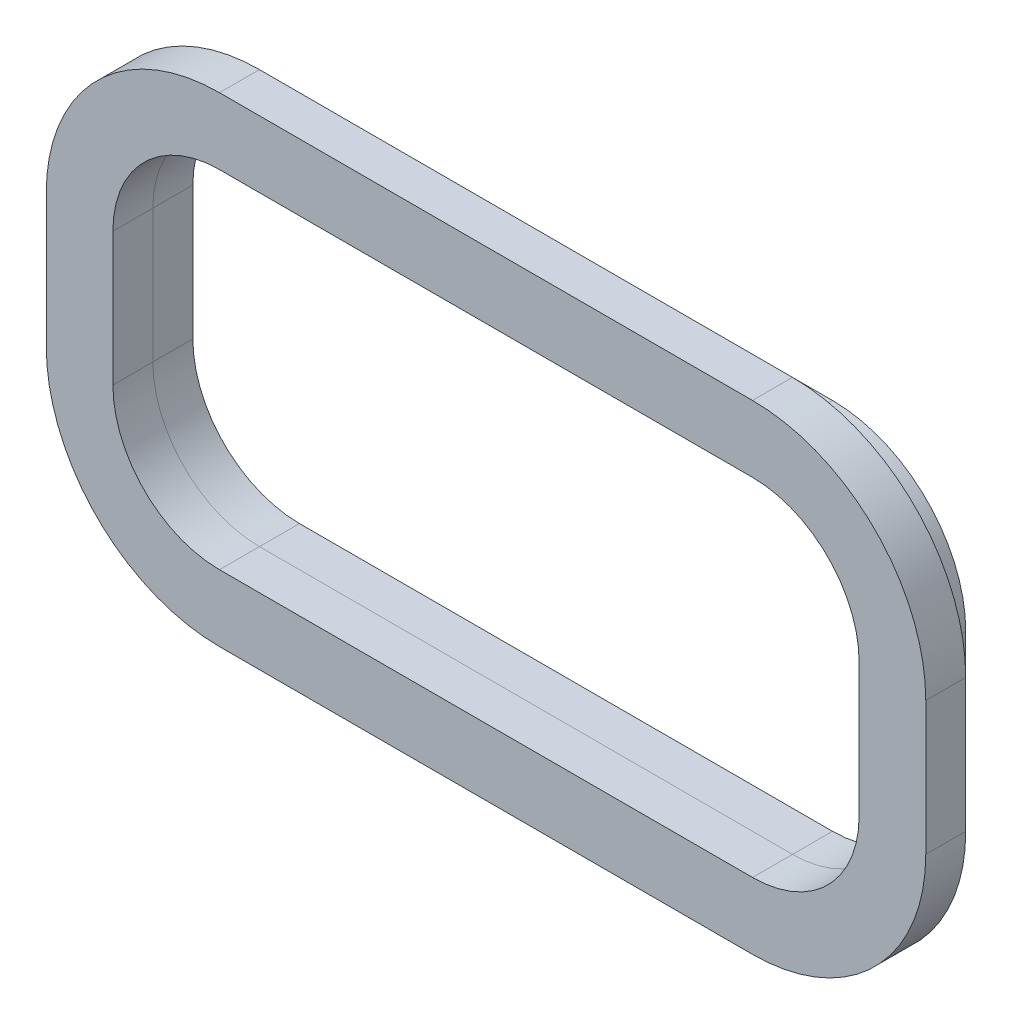
ISO-10303-21;
HEADER;
FILE_DESCRIPTION(('STEP AP214'),'2;1');
FILE_NAME('part.step','',(''),(''),'','','');
FILE_SCHEMA(('AUTOMOTIVE_DESIGN { 1 0 10303 214 1 1 1 1 }'));
ENDSEC;
DATA;
#1=APPLICATION_CONTEXT('core data for automotive mechanical design processes');
#2=APPLICATION_PROTOCOL_DEFINITION('international standard','automotive_design',2000,#1);
#3=PRODUCT_CONTEXT('',#1,'mechanical');
#4=PRODUCT('Part','Part','',(#3));
#5=PRODUCT_RELATED_PRODUCT_CATEGORY('part','',(#4));
#6=PRODUCT_DEFINITION_FORMATION('','',#4);
#7=PRODUCT_DEFINITION_CONTEXT('part definition',#1,'design');
#8=PRODUCT_DEFINITION('design','',#6,#7);
#9=PRODUCT_DEFINITION_SHAPE('','',#8);
#10=(LENGTH_UNIT() NAMED_UNIT(*) SI_UNIT(.MILLI.,.METRE.));
#11=(NAMED_UNIT(*) PLANE_ANGLE_UNIT() SI_UNIT($,.RADIAN.));
#12=(NAMED_UNIT(*) SI_UNIT($,.STERADIAN.) SOLID_ANGLE_UNIT());
#13=UNCERTAINTY_MEASURE_WITH_UNIT(LENGTH_MEASURE(1.E-05),#10,'distance_accuracy_value','');
#14=(GEOMETRIC_REPRESENTATION_CONTEXT(3) GLOBAL_UNCERTAINTY_ASSIGNED_CONTEXT((#13)) GLOBAL_UNIT_ASSIGNED_CONTEXT((#10,
#11,#12)) REPRESENTATION_CONTEXT('',''));
#15=CARTESIAN_POINT('',(0.,0.,0.));
#16=DIRECTION('',(0.,0.,1.));
#17=DIRECTION('',(1.,0.,0.));
#18=AXIS2_PLACEMENT_3D('',#15,#16,#17);
#19=CARTESIAN_POINT('',(0.,-17.6264705882353,6.));
#20=DIRECTION('',(0.,1.,0.));
#21=DIRECTION('',(0.,0.,1.));
#22=AXIS2_PLACEMENT_3D('',#19,#20,#21);
#23=PLANE('',#22);
#24=DIRECTION('',(1.,0.,0.));
#25=VECTOR('',#24,1.);
#26=CARTESIAN_POINT('',(0.,-17.6264705882353,3.));
#27=LINE('',#26,#25);
#28=CARTESIAN_POINT('',(-21.3216547429783,-17.6264705882353,3.));
#29=VERTEX_POINT('',#28);
#30=CARTESIAN_POINT('',(18.6783452570217,-17.6264705882353,3.));
#31=VERTEX_POINT('',#30);
#32=EDGE_CURVE('E212',#29,#31,#27,.T.);
#33=ORIENTED_EDGE('',*,*,#32,.T.);
#34=DIRECTION('',(0.,0.,-1.));
#35=VECTOR('',#34,1.);
#36=CARTESIAN_POINT('',(18.6783452570217,-17.6264705882353,6.));
#37=LINE('',#36,#35);
#38=CARTESIAN_POINT('',(18.6783452570217,-17.6264705882353,6.));
#39=VERTEX_POINT('',#38);
#40=EDGE_CURVE('E12',#39,#31,#37,.T.);
#41=ORIENTED_EDGE('',*,*,#40,.F.);
#42=DIRECTION('',(1.,0.,0.));
#43=VECTOR('',#42,1.);
#44=CARTESIAN_POINT('',(0.,-17.6264705882353,6.));
#45=LINE('',#44,#43);
#46=CARTESIAN_POINT('',(-21.3216547429783,-17.6264705882353,6.));
#47=VERTEX_POINT('',#46);
#48=EDGE_CURVE('E224',#47,#39,#45,.T.);
#49=ORIENTED_EDGE('',*,*,#48,.F.);
#50=DIRECTION('',(0.,0.,-1.));
#51=VECTOR('',#50,1.);
#52=CARTESIAN_POINT('',(-21.3216547429783,-17.6264705882353,6.));
#53=LINE('',#52,#51);
#54=EDGE_CURVE('E242',#47,#29,#53,.T.);
#55=ORIENTED_EDGE('',*,*,#54,.T.);
#56=EDGE_LOOP('',(#33,#41,#49,#55));
#57=FACE_BOUND('',#56,.T.);
#58=ADVANCED_FACE('F43',(#57),#23,.F.);
#59=CARTESIAN_POINT('',(18.6783452570217,-4.6264705882353,6.));
#60=DIRECTION('',(0.,0.,-1.));
#61=DIRECTION('',(-1.,0.,0.));
#62=AXIS2_PLACEMENT_3D('',#59,#60,#61);
#63=CYLINDRICAL_SURFACE('',#62,13.);
#64=CARTESIAN_POINT('',(18.6783452570217,-4.6264705882353,3.));
#65=DIRECTION('',(0.,0.,1.));
#66=DIRECTION('',(1.,0.,0.));
#67=AXIS2_PLACEMENT_3D('',#64,#65,#66);
#68=CIRCLE('',#67,13.);
#69=CARTESIAN_POINT('',(31.6783452570217,-4.6264705882353,3.));
#70=VERTEX_POINT('',#69);
#71=EDGE_CURVE('E245',#31,#70,#68,.T.);
#72=ORIENTED_EDGE('',*,*,#71,.T.);
#73=DIRECTION('',(0.,0.,-1.));
#74=VECTOR('',#73,1.);
#75=CARTESIAN_POINT('',(31.6783452570217,-4.6264705882353,6.));
#76=LINE('',#75,#74);
#77=CARTESIAN_POINT('',(31.6783452570217,-4.6264705882353,6.));
#78=VERTEX_POINT('',#77);
#79=EDGE_CURVE('E50',#78,#70,#76,.T.);
#80=ORIENTED_EDGE('',*,*,#79,.F.);
#81=CARTESIAN_POINT('',(18.6783452570217,-4.6264705882353,6.));
#82=DIRECTION('',(0.,0.,1.));
#83=DIRECTION('',(1.,0.,0.));
#84=AXIS2_PLACEMENT_3D('',#81,#82,#83);
#85=CIRCLE('',#84,13.);
#86=EDGE_CURVE('E227',#39,#78,#85,.T.);
#87=ORIENTED_EDGE('',*,*,#86,.F.);
#88=ORIENTED_EDGE('',*,*,#40,.T.);
#89=EDGE_LOOP('',(#72,#80,#87,#88));
#90=FACE_BOUND('',#89,.T.);
#91=ADVANCED_FACE('F300',(#90),#63,.T.);
#92=CARTESIAN_POINT('',(31.6783452570217,0.,6.));
#93=DIRECTION('',(-1.,0.,0.));
#94=DIRECTION('',(0.,-1.,0.));
#95=AXIS2_PLACEMENT_3D('',#92,#93,#94);
#96=PLANE('',#95);
#97=DIRECTION('',(0.,1.,0.));
#98=VECTOR('',#97,1.);
#99=CARTESIAN_POINT('',(31.6783452570217,0.,3.));
#100=LINE('',#99,#98);
#101=CARTESIAN_POINT('',(31.6783452570217,5.3735294117647,3.));
#102=VERTEX_POINT('',#101);
#103=EDGE_CURVE('E247',#70,#102,#100,.T.);
#104=ORIENTED_EDGE('',*,*,#103,.T.);
#105=DIRECTION('',(0.,0.,-1.));
#106=VECTOR('',#105,1.);
#107=CARTESIAN_POINT('',(31.6783452570217,5.3735294117647,6.));
#108=LINE('',#107,#106);
#109=CARTESIAN_POINT('',(31.6783452570217,5.3735294117647,6.));
#110=VERTEX_POINT('',#109);
#111=EDGE_CURVE('E272',#110,#102,#108,.T.);
#112=ORIENTED_EDGE('',*,*,#111,.F.);
#113=DIRECTION('',(0.,1.,0.));
#114=VECTOR('',#113,1.);
#115=CARTESIAN_POINT('',(31.6783452570217,0.,6.));
#116=LINE('',#115,#114);
#117=EDGE_CURVE('E230',#78,#110,#116,.T.);
#118=ORIENTED_EDGE('',*,*,#117,.F.);
#119=ORIENTED_EDGE('',*,*,#79,.T.);
#120=EDGE_LOOP('',(#104,#112,#118,#119));
#121=FACE_BOUND('',#120,.T.);
#122=ADVANCED_FACE('F279',(#121),#96,.F.);
#123=CARTESIAN_POINT('',(18.6783452570217,5.3735294117647,6.));
#124=DIRECTION('',(0.,0.,-1.));
#125=DIRECTION('',(-1.,0.,0.));
#126=AXIS2_PLACEMENT_3D('',#123,#124,#125);
#127=CYLINDRICAL_SURFACE('',#126,13.);
#128=CARTESIAN_POINT('',(18.6783452570217,5.3735294117647,3.));
#129=DIRECTION('',(0.,0.,1.));
#130=DIRECTION('',(1.,0.,0.));
#131=AXIS2_PLACEMENT_3D('',#128,#129,#130);
#132=CIRCLE('',#131,13.);
#133=CARTESIAN_POINT('',(18.6783452570217,18.3735294117647,3.));
#134=VERTEX_POINT('',#133);
#135=EDGE_CURVE('E249',#102,#134,#132,.T.);
#136=ORIENTED_EDGE('',*,*,#135,.T.);
#137=DIRECTION('',(0.,0.,-1.));
#138=VECTOR('',#137,1.);
#139=CARTESIAN_POINT('',(18.6783452570217,18.3735294117647,6.));
#140=LINE('',#139,#138);
#141=CARTESIAN_POINT('',(18.6783452570217,18.3735294117647,6.));
#142=VERTEX_POINT('',#141);
#143=EDGE_CURVE('E269',#142,#134,#140,.T.);
#144=ORIENTED_EDGE('',*,*,#143,.F.);
#145=CARTESIAN_POINT('',(18.6783452570217,5.3735294117647,6.));
#146=DIRECTION('',(0.,0.,1.));
#147=DIRECTION('',(1.,0.,0.));
#148=AXIS2_PLACEMENT_3D('',#145,#146,#147);
#149=CIRCLE('',#148,13.);
#150=EDGE_CURVE('E232',#110,#142,#149,.T.);
#151=ORIENTED_EDGE('',*,*,#150,.F.);
#152=ORIENTED_EDGE('',*,*,#111,.T.);
#153=EDGE_LOOP('',(#136,#144,#151,#152));
#154=FACE_BOUND('',#153,.T.);
#155=ADVANCED_FACE('F290',(#154),#127,.T.);
#156=CARTESIAN_POINT('',(0.,18.3735294117647,6.));
#157=DIRECTION('',(0.,-1.,0.));
#158=DIRECTION('',(1.,0.,0.));
#159=AXIS2_PLACEMENT_3D('',#156,#157,#158);
#160=PLANE('',#159);
#161=DIRECTION('',(-1.,0.,0.));
#162=VECTOR('',#161,1.);
#163=CARTESIAN_POINT('',(0.,18.3735294117647,3.));
#164=LINE('',#163,#162);
#165=CARTESIAN_POINT('',(-21.3216547429783,18.3735294117647,3.));
#166=VERTEX_POINT('',#165);
#167=EDGE_CURVE('E251',#134,#166,#164,.T.);
#168=ORIENTED_EDGE('',*,*,#167,.T.);
#169=DIRECTION('',(0.,0.,-1.));
#170=VECTOR('',#169,1.);
#171=CARTESIAN_POINT('',(-21.3216547429783,18.3735294117647,6.));
#172=LINE('',#171,#170);
#173=CARTESIAN_POINT('',(-21.3216547429783,18.3735294117647,6.));
#174=VERTEX_POINT('',#173);
#175=EDGE_CURVE('E266',#174,#166,#172,.T.);
#176=ORIENTED_EDGE('',*,*,#175,.F.);
#177=DIRECTION('',(-1.,0.,0.));
#178=VECTOR('',#177,1.);
#179=CARTESIAN_POINT('',(0.,18.3735294117647,6.));
#180=LINE('',#179,#178);
#181=EDGE_CURVE('E234',#142,#174,#180,.T.);
#182=ORIENTED_EDGE('',*,*,#181,.F.);
#183=ORIENTED_EDGE('',*,*,#143,.T.);
#184=EDGE_LOOP('',(#168,#176,#182,#183));
#185=FACE_BOUND('',#184,.T.);
#186=ADVANCED_FACE('F294',(#185),#160,.F.);
#187=CARTESIAN_POINT('',(-21.3216547429783,5.3735294117647,6.));
#188=DIRECTION('',(0.,0.,-1.));
#189=DIRECTION('',(-1.,0.,0.));
#190=AXIS2_PLACEMENT_3D('',#187,#188,#189);
#191=CYLINDRICAL_SURFACE('',#190,13.);
#192=CARTESIAN_POINT('',(-21.3216547429783,5.3735294117647,3.));
#193=DIRECTION('',(0.,0.,1.));
#194=DIRECTION('',(1.,0.,0.));
#195=AXIS2_PLACEMENT_3D('',#192,#193,#194);
#196=CIRCLE('',#195,13.);
#197=CARTESIAN_POINT('',(-34.3216547429783,5.3735294117647,3.));
#198=VERTEX_POINT('',#197);
#199=EDGE_CURVE('E253',#166,#198,#196,.T.);
#200=ORIENTED_EDGE('',*,*,#199,.T.);
#201=DIRECTION('',(0.,0.,-1.));
#202=VECTOR('',#201,1.);
#203=CARTESIAN_POINT('',(-34.3216547429783,5.3735294117647,6.));
#204=LINE('',#203,#202);
#205=CARTESIAN_POINT('',(-34.3216547429783,5.3735294117647,6.));
#206=VERTEX_POINT('',#205);
#207=EDGE_CURVE('E263',#206,#198,#204,.T.);
#208=ORIENTED_EDGE('',*,*,#207,.F.);
#209=CARTESIAN_POINT('',(-21.3216547429783,5.3735294117647,6.));
#210=DIRECTION('',(0.,0.,1.));
#211=DIRECTION('',(1.,0.,0.));
#212=AXIS2_PLACEMENT_3D('',#209,#210,#211);
#213=CIRCLE('',#212,13.);
#214=EDGE_CURVE('E236',#174,#206,#213,.T.);
#215=ORIENTED_EDGE('',*,*,#214,.F.);
#216=ORIENTED_EDGE('',*,*,#175,.T.);
#217=EDGE_LOOP('',(#200,#208,#215,#216));
#218=FACE_BOUND('',#217,.T.);
#219=ADVANCED_FACE('F313',(#218),#191,.T.);
#220=CARTESIAN_POINT('',(-34.3216547429783,0.,6.));
#221=DIRECTION('',(1.,0.,0.));
#222=DIRECTION('',(0.,1.,0.));
#223=AXIS2_PLACEMENT_3D('',#220,#221,#222);
#224=PLANE('',#223);
#225=DIRECTION('',(0.,-1.,0.));
#226=VECTOR('',#225,1.);
#227=CARTESIAN_POINT('',(-34.3216547429783,0.,3.));
#228=LINE('',#227,#226);
#229=CARTESIAN_POINT('',(-34.3216547429783,-4.6264705882353,3.));
#230=VERTEX_POINT('',#229);
#231=EDGE_CURVE('E255',#198,#230,#228,.T.);
#232=ORIENTED_EDGE('',*,*,#231,.T.);
#233=DIRECTION('',(0.,0.,-1.));
#234=VECTOR('',#233,1.);
#235=CARTESIAN_POINT('',(-34.3216547429783,-4.6264705882353,6.));
#236=LINE('',#235,#234);
#237=CARTESIAN_POINT('',(-34.3216547429783,-4.6264705882353,6.));
#238=VERTEX_POINT('',#237);
#239=EDGE_CURVE('E260',#238,#230,#236,.T.);
#240=ORIENTED_EDGE('',*,*,#239,.F.);
#241=DIRECTION('',(0.,-1.,0.));
#242=VECTOR('',#241,1.);
#243=CARTESIAN_POINT('',(-34.3216547429783,0.,6.));
#244=LINE('',#243,#242);
#245=EDGE_CURVE('E238',#206,#238,#244,.T.);
#246=ORIENTED_EDGE('',*,*,#245,.F.);
#247=ORIENTED_EDGE('',*,*,#207,.T.);
#248=EDGE_LOOP('',(#232,#240,#246,#247));
#249=FACE_BOUND('',#248,.T.);
#250=ADVANCED_FACE('F311',(#249),#224,.F.);
#251=CARTESIAN_POINT('',(-21.3216547429783,-4.6264705882353,6.));
#252=DIRECTION('',(0.,0.,-1.));
#253=DIRECTION('',(-1.,0.,0.));
#254=AXIS2_PLACEMENT_3D('',#251,#252,#253);
#255=CYLINDRICAL_SURFACE('',#254,13.);
#256=CARTESIAN_POINT('',(-21.3216547429783,-4.6264705882353,3.));
#257=DIRECTION('',(0.,0.,1.));
#258=DIRECTION('',(1.,0.,0.));
#259=AXIS2_PLACEMENT_3D('',#256,#257,#258);
#260=CIRCLE('',#259,13.);
#261=EDGE_CURVE('E228',#230,#29,#260,.T.);
#262=ORIENTED_EDGE('',*,*,#261,.T.);
#263=ORIENTED_EDGE('',*,*,#54,.F.);
#264=CARTESIAN_POINT('',(-21.3216547429783,-4.6264705882353,6.));
#265=DIRECTION('',(0.,0.,1.));
#266=DIRECTION('',(1.,0.,0.));
#267=AXIS2_PLACEMENT_3D('',#264,#265,#266);
#268=CIRCLE('',#267,13.);
#269=EDGE_CURVE('E240',#238,#47,#268,.T.);
#270=ORIENTED_EDGE('',*,*,#269,.F.);
#271=ORIENTED_EDGE('',*,*,#239,.T.);
#272=EDGE_LOOP('',(#262,#263,#270,#271));
#273=FACE_BOUND('',#272,.T.);
#274=ADVANCED_FACE('F306',(#273),#255,.T.);
#275=CARTESIAN_POINT('',(0.,0.,6.));
#276=DIRECTION('',(0.,0.,1.));
#277=DIRECTION('',(1.,0.,0.));
#278=AXIS2_PLACEMENT_3D('',#275,#276,#277);
#279=PLANE('',#278);
#280=CARTESIAN_POINT('',(-21.3216547429783,5.3735294117647,6.));
#281=DIRECTION('',(0.,0.,-1.));
#282=DIRECTION('',(-1.,0.,0.));
#283=AXIS2_PLACEMENT_3D('',#280,#281,#282);
#284=CIRCLE('',#283,8.);
#285=CARTESIAN_POINT('',(-29.3216547429783,5.3735294117647,6.));
#286=VERTEX_POINT('',#285);
#287=CARTESIAN_POINT('',(-21.3216547429783,13.3735294117647,6.));
#288=VERTEX_POINT('',#287);
#289=EDGE_CURVE('E157',#286,#288,#284,.T.);
#290=ORIENTED_EDGE('',*,*,#289,.T.);
#291=DIRECTION('',(1.,0.,0.));
#292=VECTOR('',#291,1.);
#293=CARTESIAN_POINT('',(-21.3216547429783,13.3735294117647,6.));
#294=LINE('',#293,#292);
#295=CARTESIAN_POINT('',(18.6783452570217,13.3735294117647,6.));
#296=VERTEX_POINT('',#295);
#297=EDGE_CURVE('E166',#288,#296,#294,.T.);
#298=ORIENTED_EDGE('',*,*,#297,.T.);
#299=CARTESIAN_POINT('',(18.6783452570217,5.3735294117647,6.));
#300=DIRECTION('',(0.,0.,-1.));
#301=DIRECTION('',(-1.,0.,0.));
#302=AXIS2_PLACEMENT_3D('',#299,#300,#301);
#303=CIRCLE('',#302,8.);
#304=CARTESIAN_POINT('',(26.6783452570217,5.3735294117647,6.));
#305=VERTEX_POINT('',#304);
#306=EDGE_CURVE('E57',#296,#305,#303,.T.);
#307=ORIENTED_EDGE('',*,*,#306,.T.);
#308=DIRECTION('',(0.,-1.,0.));
#309=VECTOR('',#308,1.);
#310=CARTESIAN_POINT('',(26.6783452570217,5.37352941176469,6.));
#311=LINE('',#310,#309);
#312=CARTESIAN_POINT('',(26.6783452570217,-4.62647058823531,6.));
#313=VERTEX_POINT('',#312);
#314=EDGE_CURVE('E181',#305,#313,#311,.T.);
#315=ORIENTED_EDGE('',*,*,#314,.T.);
#316=CARTESIAN_POINT('',(18.6783452570217,-4.6264705882353,6.));
#317=DIRECTION('',(0.,0.,-1.));
#318=DIRECTION('',(-1.,0.,0.));
#319=AXIS2_PLACEMENT_3D('',#316,#317,#318);
#320=CIRCLE('',#319,7.99999999999999);
#321=CARTESIAN_POINT('',(18.6783452570217,-12.6264705882353,6.));
#322=VERTEX_POINT('',#321);
#323=EDGE_CURVE('E184',#313,#322,#320,.T.);
#324=ORIENTED_EDGE('',*,*,#323,.T.);
#325=DIRECTION('',(-1.,0.,0.));
#326=VECTOR('',#325,1.);
#327=CARTESIAN_POINT('',(18.6783452570217,-12.6264705882353,6.));
#328=LINE('',#327,#326);
#329=CARTESIAN_POINT('',(-21.3216547429783,-12.6264705882353,6.));
#330=VERTEX_POINT('',#329);
#331=EDGE_CURVE('E187',#322,#330,#328,.T.);
#332=ORIENTED_EDGE('',*,*,#331,.T.);
#333=CARTESIAN_POINT('',(-21.3216547429783,-4.6264705882353,6.));
#334=DIRECTION('',(0.,0.,-1.));
#335=DIRECTION('',(-1.,0.,0.));
#336=AXIS2_PLACEMENT_3D('',#333,#334,#335);
#337=CIRCLE('',#336,8.);
#338=CARTESIAN_POINT('',(-29.3216547429783,-4.6264705882353,6.));
#339=VERTEX_POINT('',#338);
#340=EDGE_CURVE('E190',#330,#339,#337,.T.);
#341=ORIENTED_EDGE('',*,*,#340,.T.);
#342=DIRECTION('',(0.,1.,0.));
#343=VECTOR('',#342,1.);
#344=CARTESIAN_POINT('',(-29.3216547429783,-4.6264705882353,6.));
#345=LINE('',#344,#343);
#346=EDGE_CURVE('E163',#339,#286,#345,.T.);
#347=ORIENTED_EDGE('',*,*,#346,.T.);
#348=EDGE_LOOP('',(#290,#298,#307,#315,#324,#332,#341,#347));
#349=FACE_BOUND('',#348,.T.);
#350=ORIENTED_EDGE('',*,*,#48,.T.);
#351=ORIENTED_EDGE('',*,*,#86,.T.);
#352=ORIENTED_EDGE('',*,*,#117,.T.);
#353=ORIENTED_EDGE('',*,*,#150,.T.);
#354=ORIENTED_EDGE('',*,*,#181,.T.);
#355=ORIENTED_EDGE('',*,*,#214,.T.);
#356=ORIENTED_EDGE('',*,*,#245,.T.);
#357=ORIENTED_EDGE('',*,*,#269,.T.);
#358=EDGE_LOOP('',(#350,#351,#352,#353,#354,#355,#356,#357));
#359=FACE_BOUND('',#358,.T.);
#360=ADVANCED_FACE('F170',(#349,#359),#279,.T.);
#361=CARTESIAN_POINT('',(0.,0.,3.));
#362=DIRECTION('',(0.,0.,1.));
#363=DIRECTION('',(1.,0.,0.));
#364=AXIS2_PLACEMENT_3D('',#361,#362,#363);
#365=PLANE('',#364);
#366=DIRECTION('',(1.,0.,0.));
#367=VECTOR('',#366,1.);
#368=CARTESIAN_POINT('',(-21.3216547429783,13.3735294117647,3.));
#369=LINE('',#368,#367);
#370=CARTESIAN_POINT('',(-21.3216547429783,13.3735294117647,3.));
#371=VERTEX_POINT('',#370);
#372=CARTESIAN_POINT('',(18.6783452570217,13.3735294117647,3.));
#373=VERTEX_POINT('',#372);
#374=EDGE_CURVE('E194',#371,#373,#369,.T.);
#375=ORIENTED_EDGE('',*,*,#374,.F.);
#376=CARTESIAN_POINT('',(-21.3216547429783,5.3735294117647,3.));
#377=DIRECTION('',(0.,0.,-1.));
#378=DIRECTION('',(-1.,0.,0.));
#379=AXIS2_PLACEMENT_3D('',#376,#377,#378);
#380=CIRCLE('',#379,8.);
#381=CARTESIAN_POINT('',(-29.3216547429783,5.3735294117647,3.));
#382=VERTEX_POINT('',#381);
#383=EDGE_CURVE('E65',#382,#371,#380,.T.);
#384=ORIENTED_EDGE('',*,*,#383,.F.);
#385=DIRECTION('',(0.,1.,0.));
#386=VECTOR('',#385,1.);
#387=CARTESIAN_POINT('',(-29.3216547429783,-4.6264705882353,3.));
#388=LINE('',#387,#386);
#389=CARTESIAN_POINT('',(-29.3216547429783,-4.6264705882353,3.));
#390=VERTEX_POINT('',#389);
#391=EDGE_CURVE('E174',#390,#382,#388,.T.);
#392=ORIENTED_EDGE('',*,*,#391,.F.);
#393=CARTESIAN_POINT('',(-21.3216547429783,-4.6264705882353,3.));
#394=DIRECTION('',(0.,0.,-1.));
#395=DIRECTION('',(-1.,0.,0.));
#396=AXIS2_PLACEMENT_3D('',#393,#394,#395);
#397=CIRCLE('',#396,8.);
#398=CARTESIAN_POINT('',(-21.3216547429783,-12.6264705882353,3.));
#399=VERTEX_POINT('',#398);
#400=EDGE_CURVE('E177',#399,#390,#397,.T.);
#401=ORIENTED_EDGE('',*,*,#400,.F.);
#402=DIRECTION('',(-1.,0.,0.));
#403=VECTOR('',#402,1.);
#404=CARTESIAN_POINT('',(18.6783452570217,-12.6264705882353,3.));
#405=LINE('',#404,#403);
#406=CARTESIAN_POINT('',(18.6783452570217,-12.6264705882353,3.));
#407=VERTEX_POINT('',#406);
#408=EDGE_CURVE('E205',#407,#399,#405,.T.);
#409=ORIENTED_EDGE('',*,*,#408,.F.);
#410=CARTESIAN_POINT('',(18.6783452570217,-4.6264705882353,3.));
#411=DIRECTION('',(0.,0.,-1.));
#412=DIRECTION('',(-1.,0.,0.));
#413=AXIS2_PLACEMENT_3D('',#410,#411,#412);
#414=CIRCLE('',#413,7.99999999999999);
#415=CARTESIAN_POINT('',(26.6783452570217,-4.62647058823531,3.));
#416=VERTEX_POINT('',#415);
#417=EDGE_CURVE('E202',#416,#407,#414,.T.);
#418=ORIENTED_EDGE('',*,*,#417,.F.);
#419=DIRECTION('',(0.,-1.,0.));
#420=VECTOR('',#419,1.);
#421=CARTESIAN_POINT('',(26.6783452570217,5.37352941176469,3.));
#422=LINE('',#421,#420);
#423=CARTESIAN_POINT('',(26.6783452570217,5.3735294117647,3.));
#424=VERTEX_POINT('',#423);
#425=EDGE_CURVE('E199',#424,#416,#422,.T.);
#426=ORIENTED_EDGE('',*,*,#425,.F.);
#427=CARTESIAN_POINT('',(18.6783452570217,5.3735294117647,3.));
#428=DIRECTION('',(0.,0.,-1.));
#429=DIRECTION('',(-1.,0.,0.));
#430=AXIS2_PLACEMENT_3D('',#427,#428,#429);
#431=CIRCLE('',#430,8.);
#432=EDGE_CURVE('E196',#373,#424,#431,.T.);
#433=ORIENTED_EDGE('',*,*,#432,.F.);
#434=EDGE_LOOP('',(#375,#384,#392,#401,#409,#418,#426,#433));
#435=FACE_BOUND('',#434,.T.);
#436=ORIENTED_EDGE('',*,*,#32,.F.);
#437=ORIENTED_EDGE('',*,*,#261,.F.);
#438=ORIENTED_EDGE('',*,*,#231,.F.);
#439=ORIENTED_EDGE('',*,*,#199,.F.);
#440=ORIENTED_EDGE('',*,*,#167,.F.);
#441=ORIENTED_EDGE('',*,*,#135,.F.);
#442=ORIENTED_EDGE('',*,*,#103,.F.);
#443=ORIENTED_EDGE('',*,*,#71,.F.);
#444=EDGE_LOOP('',(#436,#437,#438,#439,#440,#441,#442,#443));
#445=FACE_BOUND('',#444,.T.);
#446=ADVANCED_FACE('F285',(#435,#445),#365,.F.);
#447=CARTESIAN_POINT('',(-21.3216547429783,5.3735294117647,6.));
#448=DIRECTION('',(0.,0.,-1.));
#449=DIRECTION('',(-1.,0.,0.));
#450=AXIS2_PLACEMENT_3D('',#447,#448,#449);
#451=CYLINDRICAL_SURFACE('',#450,8.);
#452=ORIENTED_EDGE('',*,*,#383,.T.);
#453=DIRECTION('',(0.,0.,-1.));
#454=VECTOR('',#453,1.);
#455=CARTESIAN_POINT('',(-21.3216547429783,13.3735294117647,6.));
#456=LINE('',#455,#454);
#457=EDGE_CURVE('E153',#288,#371,#456,.T.);
#458=ORIENTED_EDGE('',*,*,#457,.F.);
#459=ORIENTED_EDGE('',*,*,#289,.F.);
#460=DIRECTION('',(0.,0.,-1.));
#461=VECTOR('',#460,1.);
#462=CARTESIAN_POINT('',(-29.3216547429783,5.3735294117647,6.));
#463=LINE('',#462,#461);
#464=EDGE_CURVE('E210',#286,#382,#463,.T.);
#465=ORIENTED_EDGE('',*,*,#464,.T.);
#466=EDGE_LOOP('',(#452,#458,#459,#465));
#467=FACE_BOUND('',#466,.T.);
#468=ADVANCED_FACE('F155',(#467),#451,.F.);
#469=CARTESIAN_POINT('',(-29.3216547429783,-4.6264705882353,6.));
#470=DIRECTION('',(-1.,0.,0.));
#471=DIRECTION('',(0.,0.,1.));
#472=AXIS2_PLACEMENT_3D('',#469,#470,#471);
#473=PLANE('',#472);
#474=ORIENTED_EDGE('',*,*,#391,.T.);
#475=ORIENTED_EDGE('',*,*,#464,.F.);
#476=ORIENTED_EDGE('',*,*,#346,.F.);
#477=DIRECTION('',(0.,0.,-1.));
#478=VECTOR('',#477,1.);
#479=CARTESIAN_POINT('',(-29.3216547429783,-4.6264705882353,6.));
#480=LINE('',#479,#478);
#481=EDGE_CURVE('E213',#339,#390,#480,.T.);
#482=ORIENTED_EDGE('',*,*,#481,.T.);
#483=EDGE_LOOP('',(#474,#475,#476,#482));
#484=FACE_BOUND('',#483,.T.);
#485=ADVANCED_FACE('F384',(#484),#473,.F.);
#486=CARTESIAN_POINT('',(-21.3216547429783,-4.6264705882353,6.));
#487=DIRECTION('',(0.,0.,-1.));
#488=DIRECTION('',(-1.,0.,0.));
#489=AXIS2_PLACEMENT_3D('',#486,#487,#488);
#490=CYLINDRICAL_SURFACE('',#489,8.);
#491=ORIENTED_EDGE('',*,*,#400,.T.);
#492=ORIENTED_EDGE('',*,*,#481,.F.);
#493=ORIENTED_EDGE('',*,*,#340,.F.);
#494=DIRECTION('',(0.,0.,-1.));
#495=VECTOR('',#494,1.);
#496=CARTESIAN_POINT('',(-21.3216547429783,-12.6264705882353,6.));
#497=LINE('',#496,#495);
#498=EDGE_CURVE('E215',#330,#399,#497,.T.);
#499=ORIENTED_EDGE('',*,*,#498,.T.);
#500=EDGE_LOOP('',(#491,#492,#493,#499));
#501=FACE_BOUND('',#500,.T.);
#502=ADVANCED_FACE('F393',(#501),#490,.F.);
#503=CARTESIAN_POINT('',(18.6783452570217,-12.6264705882353,6.));
#504=DIRECTION('',(0.,-1.,0.));
#505=DIRECTION('',(1.,0.,0.));
#506=AXIS2_PLACEMENT_3D('',#503,#504,#505);
#507=PLANE('',#506);
#508=ORIENTED_EDGE('',*,*,#408,.T.);
#509=ORIENTED_EDGE('',*,*,#498,.F.);
#510=ORIENTED_EDGE('',*,*,#331,.F.);
#511=DIRECTION('',(0.,0.,-1.));
#512=VECTOR('',#511,1.);
#513=CARTESIAN_POINT('',(18.6783452570217,-12.6264705882353,6.));
#514=LINE('',#513,#512);
#515=EDGE_CURVE('E217',#322,#407,#514,.T.);
#516=ORIENTED_EDGE('',*,*,#515,.T.);
#517=EDGE_LOOP('',(#508,#509,#510,#516));
#518=FACE_BOUND('',#517,.T.);
#519=ADVANCED_FACE('F403',(#518),#507,.F.);
#520=CARTESIAN_POINT('',(18.6783452570217,-4.6264705882353,6.));
#521=DIRECTION('',(0.,0.,-1.));
#522=DIRECTION('',(-1.,0.,0.));
#523=AXIS2_PLACEMENT_3D('',#520,#521,#522);
#524=CYLINDRICAL_SURFACE('',#523,7.99999999999999);
#525=ORIENTED_EDGE('',*,*,#417,.T.);
#526=ORIENTED_EDGE('',*,*,#515,.F.);
#527=ORIENTED_EDGE('',*,*,#323,.F.);
#528=DIRECTION('',(0.,0.,-1.));
#529=VECTOR('',#528,1.);
#530=CARTESIAN_POINT('',(26.6783452570217,-4.62647058823531,6.));
#531=LINE('',#530,#529);
#532=EDGE_CURVE('E219',#313,#416,#531,.T.);
#533=ORIENTED_EDGE('',*,*,#532,.T.);
#534=EDGE_LOOP('',(#525,#526,#527,#533));
#535=FACE_BOUND('',#534,.T.);
#536=ADVANCED_FACE('F413',(#535),#524,.F.);
#537=CARTESIAN_POINT('',(26.6783452570217,5.37352941176469,6.));
#538=DIRECTION('',(1.,0.,0.));
#539=DIRECTION('',(0.,1.,0.));
#540=AXIS2_PLACEMENT_3D('',#537,#538,#539);
#541=PLANE('',#540);
#542=ORIENTED_EDGE('',*,*,#425,.T.);
#543=ORIENTED_EDGE('',*,*,#532,.F.);
#544=ORIENTED_EDGE('',*,*,#314,.F.);
#545=DIRECTION('',(0.,0.,-1.));
#546=VECTOR('',#545,1.);
#547=CARTESIAN_POINT('',(26.6783452570217,5.3735294117647,6.));
#548=LINE('',#547,#546);
#549=EDGE_CURVE('E221',#305,#424,#548,.T.);
#550=ORIENTED_EDGE('',*,*,#549,.T.);
#551=EDGE_LOOP('',(#542,#543,#544,#550));
#552=FACE_BOUND('',#551,.T.);
#553=ADVANCED_FACE('F423',(#552),#541,.F.);
#554=CARTESIAN_POINT('',(18.6783452570217,5.3735294117647,6.));
#555=DIRECTION('',(0.,0.,-1.));
#556=DIRECTION('',(-1.,0.,0.));
#557=AXIS2_PLACEMENT_3D('',#554,#555,#556);
#558=CYLINDRICAL_SURFACE('',#557,8.);
#559=ORIENTED_EDGE('',*,*,#432,.T.);
#560=ORIENTED_EDGE('',*,*,#549,.F.);
#561=ORIENTED_EDGE('',*,*,#306,.F.);
#562=DIRECTION('',(0.,0.,-1.));
#563=VECTOR('',#562,1.);
#564=CARTESIAN_POINT('',(18.6783452570217,13.3735294117647,6.));
#565=LINE('',#564,#563);
#566=EDGE_CURVE('E162',#296,#373,#565,.T.);
#567=ORIENTED_EDGE('',*,*,#566,.T.);
#568=EDGE_LOOP('',(#559,#560,#561,#567));
#569=FACE_BOUND('',#568,.T.);
#570=ADVANCED_FACE('F433',(#569),#558,.F.);
#571=CARTESIAN_POINT('',(-21.3216547429783,13.3735294117647,6.));
#572=DIRECTION('',(0.,1.,0.));
#573=DIRECTION('',(-1.,0.,0.));
#574=AXIS2_PLACEMENT_3D('',#571,#572,#573);
#575=PLANE('',#574);
#576=ORIENTED_EDGE('',*,*,#374,.T.);
#577=ORIENTED_EDGE('',*,*,#566,.F.);
#578=ORIENTED_EDGE('',*,*,#297,.F.);
#579=ORIENTED_EDGE('',*,*,#457,.T.);
#580=EDGE_LOOP('',(#576,#577,#578,#579));
#581=FACE_BOUND('',#580,.T.);
#582=ADVANCED_FACE('F167',(#581),#575,.F.);
#583=CLOSED_SHELL('',(#58,#91,#122,#155,#186,#219,#250,#274,#360,#446,#468,#485,#502,#519,#536,
#553,#570,#582));
#584=MANIFOLD_SOLID_BREP('B2',#583);
#585=CARTESIAN_POINT('',(18.6783452570217,5.3735294117647,3.));
#586=DIRECTION('',(0.,0.,1.));
#587=DIRECTION('',(1.,0.,0.));
#588=AXIS2_PLACEMENT_3D('',#585,#586,#587);
#589=PLANE('',#588);
#590=CARTESIAN_POINT('',(18.6783452570217,5.3735294117647,3.));
#591=DIRECTION('',(0.,0.,1.));
#592=DIRECTION('',(1.,0.,0.));
#593=AXIS2_PLACEMENT_3D('',#590,#591,#592);
#594=CIRCLE('',#593,10.);
#595=CARTESIAN_POINT('',(28.6783452570217,5.3735294117647,3.));
#596=VERTEX_POINT('',#595);
#597=CARTESIAN_POINT('',(18.6783452570217,15.3735294117647,3.));
#598=VERTEX_POINT('',#597);
#599=EDGE_CURVE('E659',#596,#598,#594,.T.);
#600=ORIENTED_EDGE('',*,*,#599,.T.);
#601=DIRECTION('',(-1.,0.,0.));
#602=VECTOR('',#601,1.);
#603=CARTESIAN_POINT('',(18.6783452570217,15.3735294117647,3.));
#604=LINE('',#603,#602);
#605=CARTESIAN_POINT('',(-21.3216547429783,15.3735294117647,3.));
#606=VERTEX_POINT('',#605);
#607=EDGE_CURVE('E662',#598,#606,#604,.T.);
#608=ORIENTED_EDGE('',*,*,#607,.T.);
#609=CARTESIAN_POINT('',(-21.3216547429783,5.3735294117647,3.));
#610=DIRECTION('',(0.,0.,1.));
#611=DIRECTION('',(1.,0.,0.));
#612=AXIS2_PLACEMENT_3D('',#609,#610,#611);
#613=CIRCLE('',#612,10.);
#614=CARTESIAN_POINT('',(-31.3216547429783,5.3735294117647,3.));
#615=VERTEX_POINT('',#614);
#616=EDGE_CURVE('E665',#606,#615,#613,.T.);
#617=ORIENTED_EDGE('',*,*,#616,.T.);
#618=DIRECTION('',(0.,-1.,0.));
#619=VECTOR('',#618,1.);
#620=CARTESIAN_POINT('',(-31.3216547429783,5.3735294117647,3.));
#621=LINE('',#620,#619);
#622=CARTESIAN_POINT('',(-31.3216547429783,-4.6264705882353,3.));
#623=VERTEX_POINT('',#622);
#624=EDGE_CURVE('E667',#615,#623,#621,.T.);
#625=ORIENTED_EDGE('',*,*,#624,.T.);
#626=CARTESIAN_POINT('',(-21.3216547429783,-4.6264705882353,3.));
#627=DIRECTION('',(0.,0.,1.));
#628=DIRECTION('',(1.,0.,0.));
#629=AXIS2_PLACEMENT_3D('',#626,#627,#628);
#630=CIRCLE('',#629,10.);
#631=CARTESIAN_POINT('',(-21.3216547429783,-14.6264705882353,3.));
#632=VERTEX_POINT('',#631);
#633=EDGE_CURVE('E669',#623,#632,#630,.T.);
#634=ORIENTED_EDGE('',*,*,#633,.T.);
#635=DIRECTION('',(1.,0.,0.));
#636=VECTOR('',#635,1.);
#637=CARTESIAN_POINT('',(-21.3216547429783,-14.6264705882353,3.));
#638=LINE('',#637,#636);
#639=CARTESIAN_POINT('',(18.6783452570217,-14.6264705882353,3.));
#640=VERTEX_POINT('',#639);
#641=EDGE_CURVE('E671',#632,#640,#638,.T.);
#642=ORIENTED_EDGE('',*,*,#641,.T.);
#643=CARTESIAN_POINT('',(18.6783452570217,-4.6264705882353,3.));
#644=DIRECTION('',(0.,0.,1.));
#645=DIRECTION('',(1.,0.,0.));
#646=AXIS2_PLACEMENT_3D('',#643,#644,#645);
#647=CIRCLE('',#646,9.99999999999999);
#648=CARTESIAN_POINT('',(28.6783452570217,-4.6264705882353,3.));
#649=VERTEX_POINT('',#648);
#650=EDGE_CURVE('E673',#640,#649,#647,.T.);
#651=ORIENTED_EDGE('',*,*,#650,.T.);
#652=DIRECTION('',(0.,1.,0.));
#653=VECTOR('',#652,1.);
#654=CARTESIAN_POINT('',(28.6783452570217,-4.6264705882353,3.));
#655=LINE('',#654,#653);
#656=EDGE_CURVE('E675',#649,#596,#655,.T.);
#657=ORIENTED_EDGE('',*,*,#656,.T.);
#658=EDGE_LOOP('',(#600,#608,#617,#625,#634,#642,#651,#657));
#659=FACE_BOUND('',#658,.T.);
#660=DIRECTION('',(0.,1.,0.));
#661=VECTOR('',#660,1.);
#662=CARTESIAN_POINT('',(26.6783452570217,-4.62647058823532,3.));
#663=LINE('',#662,#661);
#664=CARTESIAN_POINT('',(26.6783452570217,-4.62647058823532,3.));
#665=VERTEX_POINT('',#664);
#666=CARTESIAN_POINT('',(26.6783452570217,5.3735294117647,3.));
#667=VERTEX_POINT('',#666);
#668=EDGE_CURVE('E602',#665,#667,#663,.T.);
#669=ORIENTED_EDGE('',*,*,#668,.F.);
#670=CARTESIAN_POINT('',(18.6783452570217,-4.6264705882353,3.));
#671=DIRECTION('',(0.,0.,1.));
#672=DIRECTION('',(1.,0.,0.));
#673=AXIS2_PLACEMENT_3D('',#670,#671,#672);
#674=CIRCLE('',#673,7.99999999999999);
#675=CARTESIAN_POINT('',(18.6783452570217,-12.6264705882353,3.));
#676=VERTEX_POINT('',#675);
#677=EDGE_CURVE('E594',#676,#665,#674,.T.);
#678=ORIENTED_EDGE('',*,*,#677,.F.);
#679=DIRECTION('',(1.,0.,0.));
#680=VECTOR('',#679,1.);
#681=CARTESIAN_POINT('',(-21.3216547429783,-12.6264705882353,3.));
#682=LINE('',#681,#680);
#683=CARTESIAN_POINT('',(-21.3216547429783,-12.6264705882353,3.));
#684=VERTEX_POINT('',#683);
#685=EDGE_CURVE('E627',#684,#676,#682,.T.);
#686=ORIENTED_EDGE('',*,*,#685,.F.);
#687=CARTESIAN_POINT('',(-21.3216547429783,-4.6264705882353,3.));
#688=DIRECTION('',(0.,0.,1.));
#689=DIRECTION('',(1.,0.,0.));
#690=AXIS2_PLACEMENT_3D('',#687,#688,#689);
#691=CIRCLE('',#690,8.);
#692=CARTESIAN_POINT('',(-29.3216547429783,-4.62647058823529,3.));
#693=VERTEX_POINT('',#692);
#694=EDGE_CURVE('E625',#693,#684,#691,.T.);
#695=ORIENTED_EDGE('',*,*,#694,.F.);
#696=DIRECTION('',(0.,-1.,0.));
#697=VECTOR('',#696,1.);
#698=CARTESIAN_POINT('',(-29.3216547429783,5.3735294117647,3.));
#699=LINE('',#698,#697);
#700=CARTESIAN_POINT('',(-29.3216547429783,5.3735294117647,3.));
#701=VERTEX_POINT('',#700);
#702=EDGE_CURVE('E623',#701,#693,#699,.T.);
#703=ORIENTED_EDGE('',*,*,#702,.F.);
#704=CARTESIAN_POINT('',(-21.3216547429783,5.3735294117647,3.));
#705=DIRECTION('',(0.,0.,1.));
#706=DIRECTION('',(1.,0.,0.));
#707=AXIS2_PLACEMENT_3D('',#704,#705,#706);
#708=CIRCLE('',#707,8.);
#709=CARTESIAN_POINT('',(-21.3216547429783,13.3735294117647,3.));
#710=VERTEX_POINT('',#709);
#711=EDGE_CURVE('E621',#710,#701,#708,.T.);
#712=ORIENTED_EDGE('',*,*,#711,.F.);
#713=DIRECTION('',(-1.,0.,0.));
#714=VECTOR('',#713,1.);
#715=CARTESIAN_POINT('',(18.6783452570217,13.3735294117647,3.));
#716=LINE('',#715,#714);
#717=CARTESIAN_POINT('',(18.6783452570217,13.3735294117647,3.));
#718=VERTEX_POINT('',#717);
#719=EDGE_CURVE('E617',#718,#710,#716,.T.);
#720=ORIENTED_EDGE('',*,*,#719,.F.);
#721=CARTESIAN_POINT('',(18.6783452570217,5.3735294117647,3.));
#722=DIRECTION('',(0.,0.,1.));
#723=DIRECTION('',(1.,0.,0.));
#724=AXIS2_PLACEMENT_3D('',#721,#722,#723);
#725=CIRCLE('',#724,8.);
#726=EDGE_CURVE('E615',#667,#718,#725,.T.);
#727=ORIENTED_EDGE('',*,*,#726,.F.);
#728=EDGE_LOOP('',(#669,#678,#686,#695,#703,#712,#720,#727));
#729=FACE_BOUND('',#728,.T.);
#730=ADVANCED_FACE('F481',(#659,#729),#589,.T.);
#731=CARTESIAN_POINT('',(18.6783452570217,5.3735294117647,0.));
#732=DIRECTION('',(0.,0.,1.));
#733=DIRECTION('',(1.,0.,0.));
#734=AXIS2_PLACEMENT_3D('',#731,#732,#733);
#735=PLANE('',#734);
#736=CARTESIAN_POINT('',(18.6783452570217,5.3735294117647,0.));
#737=DIRECTION('',(0.,0.,1.));
#738=DIRECTION('',(1.,0.,0.));
#739=AXIS2_PLACEMENT_3D('',#736,#737,#738);
#740=CIRCLE('',#739,10.);
#741=CARTESIAN_POINT('',(28.6783452570217,5.3735294117647,0.));
#742=VERTEX_POINT('',#741);
#743=CARTESIAN_POINT('',(18.6783452570217,15.3735294117647,0.));
#744=VERTEX_POINT('',#743);
#745=EDGE_CURVE('E610',#742,#744,#740,.T.);
#746=ORIENTED_EDGE('',*,*,#745,.F.);
#747=DIRECTION('',(0.,1.,0.));
#748=VECTOR('',#747,1.);
#749=CARTESIAN_POINT('',(28.6783452570217,-4.6264705882353,0.));
#750=LINE('',#749,#748);
#751=CARTESIAN_POINT('',(28.6783452570217,-4.6264705882353,0.));
#752=VERTEX_POINT('',#751);
#753=EDGE_CURVE('E663',#752,#742,#750,.T.);
#754=ORIENTED_EDGE('',*,*,#753,.F.);
#755=CARTESIAN_POINT('',(18.6783452570217,-4.6264705882353,0.));
#756=DIRECTION('',(0.,0.,1.));
#757=DIRECTION('',(1.,0.,0.));
#758=AXIS2_PLACEMENT_3D('',#755,#756,#757);
#759=CIRCLE('',#758,9.99999999999999);
#760=CARTESIAN_POINT('',(18.6783452570217,-14.6264705882353,0.));
#761=VERTEX_POINT('',#760);
#762=EDGE_CURVE('E690',#761,#752,#759,.T.);
#763=ORIENTED_EDGE('',*,*,#762,.F.);
#764=DIRECTION('',(1.,0.,0.));
#765=VECTOR('',#764,1.);
#766=CARTESIAN_POINT('',(-21.3216547429783,-14.6264705882353,0.));
#767=LINE('',#766,#765);
#768=CARTESIAN_POINT('',(-21.3216547429783,-14.6264705882353,0.));
#769=VERTEX_POINT('',#768);
#770=EDGE_CURVE('E688',#769,#761,#767,.T.);
#771=ORIENTED_EDGE('',*,*,#770,.F.);
#772=CARTESIAN_POINT('',(-21.3216547429783,-4.6264705882353,0.));
#773=DIRECTION('',(0.,0.,1.));
#774=DIRECTION('',(1.,0.,0.));
#775=AXIS2_PLACEMENT_3D('',#772,#773,#774);
#776=CIRCLE('',#775,10.);
#777=CARTESIAN_POINT('',(-31.3216547429783,-4.6264705882353,0.));
#778=VERTEX_POINT('',#777);
#779=EDGE_CURVE('E686',#778,#769,#776,.T.);
#780=ORIENTED_EDGE('',*,*,#779,.F.);
#781=DIRECTION('',(0.,-1.,0.));
#782=VECTOR('',#781,1.);
#783=CARTESIAN_POINT('',(-31.3216547429783,5.3735294117647,0.));
#784=LINE('',#783,#782);
#785=CARTESIAN_POINT('',(-31.3216547429783,5.3735294117647,0.));
#786=VERTEX_POINT('',#785);
#787=EDGE_CURVE('E684',#786,#778,#784,.T.);
#788=ORIENTED_EDGE('',*,*,#787,.F.);
#789=CARTESIAN_POINT('',(-21.3216547429783,5.3735294117647,0.));
#790=DIRECTION('',(0.,0.,1.));
#791=DIRECTION('',(1.,0.,0.));
#792=AXIS2_PLACEMENT_3D('',#789,#790,#791);
#793=CIRCLE('',#792,10.);
#794=CARTESIAN_POINT('',(-21.3216547429783,15.3735294117647,0.));
#795=VERTEX_POINT('',#794);
#796=EDGE_CURVE('E682',#795,#786,#793,.T.);
#797=ORIENTED_EDGE('',*,*,#796,.F.);
#798=DIRECTION('',(-1.,0.,0.));
#799=VECTOR('',#798,1.);
#800=CARTESIAN_POINT('',(18.6783452570217,15.3735294117647,0.));
#801=LINE('',#800,#799);
#802=EDGE_CURVE('E680',#744,#795,#801,.T.);
#803=ORIENTED_EDGE('',*,*,#802,.F.);
#804=EDGE_LOOP('',(#746,#754,#763,#771,#780,#788,#797,#803));
#805=FACE_BOUND('',#804,.T.);
#806=CARTESIAN_POINT('',(18.6783452570217,-4.6264705882353,0.));
#807=DIRECTION('',(0.,0.,1.));
#808=DIRECTION('',(1.,0.,0.));
#809=AXIS2_PLACEMENT_3D('',#806,#807,#808);
#810=CIRCLE('',#809,7.99999999999999);
#811=CARTESIAN_POINT('',(18.6783452570217,-12.6264705882353,0.));
#812=VERTEX_POINT('',#811);
#813=CARTESIAN_POINT('',(26.6783452570217,-4.62647058823532,0.));
#814=VERTEX_POINT('',#813);
#815=EDGE_CURVE('E504',#812,#814,#810,.T.);
#816=ORIENTED_EDGE('',*,*,#815,.T.);
#817=DIRECTION('',(0.,1.,0.));
#818=VECTOR('',#817,1.);
#819=CARTESIAN_POINT('',(26.6783452570217,-4.62647058823532,0.));
#820=LINE('',#819,#818);
#821=CARTESIAN_POINT('',(26.6783452570217,5.3735294117647,0.));
#822=VERTEX_POINT('',#821);
#823=EDGE_CURVE('E609',#814,#822,#820,.T.);
#824=ORIENTED_EDGE('',*,*,#823,.T.);
#825=CARTESIAN_POINT('',(18.6783452570217,5.3735294117647,0.));
#826=DIRECTION('',(0.,0.,1.));
#827=DIRECTION('',(1.,0.,0.));
#828=AXIS2_PLACEMENT_3D('',#825,#826,#827);
#829=CIRCLE('',#828,8.);
#830=CARTESIAN_POINT('',(18.6783452570217,13.3735294117647,0.));
#831=VERTEX_POINT('',#830);
#832=EDGE_CURVE('E631',#822,#831,#829,.T.);
#833=ORIENTED_EDGE('',*,*,#832,.T.);
#834=DIRECTION('',(-1.,0.,0.));
#835=VECTOR('',#834,1.);
#836=CARTESIAN_POINT('',(18.6783452570217,13.3735294117647,0.));
#837=LINE('',#836,#835);
#838=CARTESIAN_POINT('',(-21.3216547429783,13.3735294117647,0.));
#839=VERTEX_POINT('',#838);
#840=EDGE_CURVE('E634',#831,#839,#837,.T.);
#841=ORIENTED_EDGE('',*,*,#840,.T.);
#842=CARTESIAN_POINT('',(-21.3216547429783,5.3735294117647,0.));
#843=DIRECTION('',(0.,0.,1.));
#844=DIRECTION('',(1.,0.,0.));
#845=AXIS2_PLACEMENT_3D('',#842,#843,#844);
#846=CIRCLE('',#845,8.);
#847=CARTESIAN_POINT('',(-29.3216547429783,5.3735294117647,0.));
#848=VERTEX_POINT('',#847);
#849=EDGE_CURVE('E637',#839,#848,#846,.T.);
#850=ORIENTED_EDGE('',*,*,#849,.T.);
#851=DIRECTION('',(0.,-1.,0.));
#852=VECTOR('',#851,1.);
#853=CARTESIAN_POINT('',(-29.3216547429783,5.3735294117647,0.));
#854=LINE('',#853,#852);
#855=CARTESIAN_POINT('',(-29.3216547429783,-4.62647058823529,0.));
#856=VERTEX_POINT('',#855);
#857=EDGE_CURVE('E640',#848,#856,#854,.T.);
#858=ORIENTED_EDGE('',*,*,#857,.T.);
#859=CARTESIAN_POINT('',(-21.3216547429783,-4.6264705882353,0.));
#860=DIRECTION('',(0.,0.,1.));
#861=DIRECTION('',(1.,0.,0.));
#862=AXIS2_PLACEMENT_3D('',#859,#860,#861);
#863=CIRCLE('',#862,8.);
#864=CARTESIAN_POINT('',(-21.3216547429783,-12.6264705882353,0.));
#865=VERTEX_POINT('',#864);
#866=EDGE_CURVE('E643',#856,#865,#863,.T.);
#867=ORIENTED_EDGE('',*,*,#866,.T.);
#868=DIRECTION('',(1.,0.,0.));
#869=VECTOR('',#868,1.);
#870=CARTESIAN_POINT('',(-21.3216547429783,-12.6264705882353,0.));
#871=LINE('',#870,#869);
#872=EDGE_CURVE('E603',#865,#812,#871,.T.);
#873=ORIENTED_EDGE('',*,*,#872,.T.);
#874=EDGE_LOOP('',(#816,#824,#833,#841,#850,#858,#867,#873));
#875=FACE_BOUND('',#874,.T.);
#876=ADVANCED_FACE('F720',(#805,#875),#735,.F.);
#877=CARTESIAN_POINT('',(18.6783452570217,5.3735294117647,3.));
#878=DIRECTION('',(0.,0.,-1.));
#879=DIRECTION('',(-1.,0.,0.));
#880=AXIS2_PLACEMENT_3D('',#877,#878,#879);
#881=CYLINDRICAL_SURFACE('',#880,10.);
#882=ORIENTED_EDGE('',*,*,#745,.T.);
#883=DIRECTION('',(0.,0.,-1.));
#884=VECTOR('',#883,1.);
#885=CARTESIAN_POINT('',(18.6783452570217,15.3735294117647,3.));
#886=LINE('',#885,#884);
#887=EDGE_CURVE('E41',#598,#744,#886,.T.);
#888=ORIENTED_EDGE('',*,*,#887,.F.);
#889=ORIENTED_EDGE('',*,*,#599,.F.);
#890=DIRECTION('',(0.,0.,-1.));
#891=VECTOR('',#890,1.);
#892=CARTESIAN_POINT('',(28.6783452570217,5.3735294117647,3.));
#893=LINE('',#892,#891);
#894=EDGE_CURVE('E677',#596,#742,#893,.T.);
#895=ORIENTED_EDGE('',*,*,#894,.T.);
#896=EDGE_LOOP('',(#882,#888,#889,#895));
#897=FACE_BOUND('',#896,.T.);
#898=ADVANCED_FACE('F483',(#897),#881,.T.);
#899=CARTESIAN_POINT('',(18.6783452570217,15.3735294117647,3.));
#900=DIRECTION('',(0.,-1.,0.));
#901=DIRECTION('',(0.,0.,-1.));
#902=AXIS2_PLACEMENT_3D('',#899,#900,#901);
#903=PLANE('',#902);
#904=ORIENTED_EDGE('',*,*,#802,.T.);
#905=DIRECTION('',(0.,0.,-1.));
#906=VECTOR('',#905,1.);
#907=CARTESIAN_POINT('',(-21.3216547429783,15.3735294117647,3.));
#908=LINE('',#907,#906);
#909=EDGE_CURVE('E489',#606,#795,#908,.T.);
#910=ORIENTED_EDGE('',*,*,#909,.F.);
#911=ORIENTED_EDGE('',*,*,#607,.F.);
#912=ORIENTED_EDGE('',*,*,#887,.T.);
#913=EDGE_LOOP('',(#904,#910,#911,#912));
#914=FACE_BOUND('',#913,.T.);
#915=ADVANCED_FACE('F737',(#914),#903,.F.);
#916=CARTESIAN_POINT('',(-21.3216547429783,5.3735294117647,3.));
#917=DIRECTION('',(0.,0.,-1.));
#918=DIRECTION('',(-1.,0.,0.));
#919=AXIS2_PLACEMENT_3D('',#916,#917,#918);
#920=CYLINDRICAL_SURFACE('',#919,10.);
#921=ORIENTED_EDGE('',*,*,#796,.T.);
#922=DIRECTION('',(0.,0.,-1.));
#923=VECTOR('',#922,1.);
#924=CARTESIAN_POINT('',(-31.3216547429783,5.3735294117647,3.));
#925=LINE('',#924,#923);
#926=EDGE_CURVE('E707',#615,#786,#925,.T.);
#927=ORIENTED_EDGE('',*,*,#926,.F.);
#928=ORIENTED_EDGE('',*,*,#616,.F.);
#929=ORIENTED_EDGE('',*,*,#909,.T.);
#930=EDGE_LOOP('',(#921,#927,#928,#929));
#931=FACE_BOUND('',#930,.T.);
#932=ADVANCED_FACE('F714',(#931),#920,.T.);
#933=CARTESIAN_POINT('',(-31.3216547429783,5.3735294117647,3.));
#934=DIRECTION('',(1.,0.,0.));
#935=DIRECTION('',(0.,0.,-1.));
#936=AXIS2_PLACEMENT_3D('',#933,#934,#935);
#937=PLANE('',#936);
#938=ORIENTED_EDGE('',*,*,#787,.T.);
#939=DIRECTION('',(0.,0.,-1.));
#940=VECTOR('',#939,1.);
#941=CARTESIAN_POINT('',(-31.3216547429783,-4.6264705882353,3.));
#942=LINE('',#941,#940);
#943=EDGE_CURVE('E704',#623,#778,#942,.T.);
#944=ORIENTED_EDGE('',*,*,#943,.F.);
#945=ORIENTED_EDGE('',*,*,#624,.F.);
#946=ORIENTED_EDGE('',*,*,#926,.T.);
#947=EDGE_LOOP('',(#938,#944,#945,#946));
#948=FACE_BOUND('',#947,.T.);
#949=ADVANCED_FACE('F726',(#948),#937,.F.);
#950=CARTESIAN_POINT('',(-21.3216547429783,-4.6264705882353,3.));
#951=DIRECTION('',(0.,0.,-1.));
#952=DIRECTION('',(-1.,0.,0.));
#953=AXIS2_PLACEMENT_3D('',#950,#951,#952);
#954=CYLINDRICAL_SURFACE('',#953,10.);
#955=ORIENTED_EDGE('',*,*,#779,.T.);
#956=DIRECTION('',(0.,0.,-1.));
#957=VECTOR('',#956,1.);
#958=CARTESIAN_POINT('',(-21.3216547429783,-14.6264705882353,3.));
#959=LINE('',#958,#957);
#960=EDGE_CURVE('E701',#632,#769,#959,.T.);
#961=ORIENTED_EDGE('',*,*,#960,.F.);
#962=ORIENTED_EDGE('',*,*,#633,.F.);
#963=ORIENTED_EDGE('',*,*,#943,.T.);
#964=EDGE_LOOP('',(#955,#961,#962,#963));
#965=FACE_BOUND('',#964,.T.);
#966=ADVANCED_FACE('F730',(#965),#954,.T.);
#967=CARTESIAN_POINT('',(-21.3216547429783,-14.6264705882353,3.));
#968=DIRECTION('',(0.,1.,0.));
#969=DIRECTION('',(0.,0.,1.));
#970=AXIS2_PLACEMENT_3D('',#967,#968,#969);
#971=PLANE('',#970);
#972=ORIENTED_EDGE('',*,*,#770,.T.);
#973=DIRECTION('',(0.,0.,-1.));
#974=VECTOR('',#973,1.);
#975=CARTESIAN_POINT('',(18.6783452570217,-14.6264705882353,3.));
#976=LINE('',#975,#974);
#977=EDGE_CURVE('E698',#640,#761,#976,.T.);
#978=ORIENTED_EDGE('',*,*,#977,.F.);
#979=ORIENTED_EDGE('',*,*,#641,.F.);
#980=ORIENTED_EDGE('',*,*,#960,.T.);
#981=EDGE_LOOP('',(#972,#978,#979,#980));
#982=FACE_BOUND('',#981,.T.);
#983=ADVANCED_FACE('F750',(#982),#971,.F.);
#984=CARTESIAN_POINT('',(18.6783452570217,-4.6264705882353,3.));
#985=DIRECTION('',(0.,0.,-1.));
#986=DIRECTION('',(-1.,0.,0.));
#987=AXIS2_PLACEMENT_3D('',#984,#985,#986);
#988=CYLINDRICAL_SURFACE('',#987,9.99999999999999);
#989=ORIENTED_EDGE('',*,*,#762,.T.);
#990=DIRECTION('',(0.,0.,-1.));
#991=VECTOR('',#990,1.);
#992=CARTESIAN_POINT('',(28.6783452570217,-4.6264705882353,3.));
#993=LINE('',#992,#991);
#994=EDGE_CURVE('E695',#649,#752,#993,.T.);
#995=ORIENTED_EDGE('',*,*,#994,.F.);
#996=ORIENTED_EDGE('',*,*,#650,.F.);
#997=ORIENTED_EDGE('',*,*,#977,.T.);
#998=EDGE_LOOP('',(#989,#995,#996,#997));
#999=FACE_BOUND('',#998,.T.);
#1000=ADVANCED_FACE('F748',(#999),#988,.T.);
#1001=CARTESIAN_POINT('',(28.6783452570217,-4.6264705882353,3.));
#1002=DIRECTION('',(-1.,0.,0.));
#1003=DIRECTION('',(0.,-1.,0.));
#1004=AXIS2_PLACEMENT_3D('',#1001,#1002,#1003);
#1005=PLANE('',#1004);
#1006=ORIENTED_EDGE('',*,*,#753,.T.);
#1007=ORIENTED_EDGE('',*,*,#894,.F.);
#1008=ORIENTED_EDGE('',*,*,#656,.F.);
#1009=ORIENTED_EDGE('',*,*,#994,.T.);
#1010=EDGE_LOOP('',(#1006,#1007,#1008,#1009));
#1011=FACE_BOUND('',#1010,.T.);
#1012=ADVANCED_FACE('F743',(#1011),#1005,.F.);
#1013=CARTESIAN_POINT('',(18.6783452570217,-4.6264705882353,3.));
#1014=DIRECTION('',(0.,0.,-1.));
#1015=DIRECTION('',(-1.,0.,0.));
#1016=AXIS2_PLACEMENT_3D('',#1013,#1014,#1015);
#1017=CYLINDRICAL_SURFACE('',#1016,7.99999999999999);
#1018=ORIENTED_EDGE('',*,*,#815,.F.);
#1019=DIRECTION('',(0.,0.,-1.));
#1020=VECTOR('',#1019,1.);
#1021=CARTESIAN_POINT('',(18.6783452570217,-12.6264705882353,3.));
#1022=LINE('',#1021,#1020);
#1023=EDGE_CURVE('E598',#676,#812,#1022,.T.);
#1024=ORIENTED_EDGE('',*,*,#1023,.F.);
#1025=ORIENTED_EDGE('',*,*,#677,.T.);
#1026=DIRECTION('',(0.,0.,-1.));
#1027=VECTOR('',#1026,1.);
#1028=CARTESIAN_POINT('',(26.6783452570217,-4.62647058823532,3.));
#1029=LINE('',#1028,#1027);
#1030=EDGE_CURVE('E597',#665,#814,#1029,.T.);
#1031=ORIENTED_EDGE('',*,*,#1030,.T.);
#1032=EDGE_LOOP('',(#1018,#1024,#1025,#1031));
#1033=FACE_BOUND('',#1032,.T.);
#1034=ADVANCED_FACE('F596',(#1033),#1017,.F.);
#1035=CARTESIAN_POINT('',(26.6783452570217,-4.62647058823532,3.));
#1036=DIRECTION('',(-1.,0.,0.));
#1037=DIRECTION('',(0.,-1.,0.));
#1038=AXIS2_PLACEMENT_3D('',#1035,#1036,#1037);
#1039=PLANE('',#1038);
#1040=ORIENTED_EDGE('',*,*,#823,.F.);
#1041=ORIENTED_EDGE('',*,*,#1030,.F.);
#1042=ORIENTED_EDGE('',*,*,#668,.T.);
#1043=DIRECTION('',(0.,0.,-1.));
#1044=VECTOR('',#1043,1.);
#1045=CARTESIAN_POINT('',(26.6783452570217,5.3735294117647,3.));
#1046=LINE('',#1045,#1044);
#1047=EDGE_CURVE('E611',#667,#822,#1046,.T.);
#1048=ORIENTED_EDGE('',*,*,#1047,.T.);
#1049=EDGE_LOOP('',(#1040,#1041,#1042,#1048));
#1050=FACE_BOUND('',#1049,.T.);
#1051=ADVANCED_FACE('F606',(#1050),#1039,.T.);
#1052=CARTESIAN_POINT('',(18.6783452570217,5.3735294117647,3.));
#1053=DIRECTION('',(0.,0.,-1.));
#1054=DIRECTION('',(-1.,0.,0.));
#1055=AXIS2_PLACEMENT_3D('',#1052,#1053,#1054);
#1056=CYLINDRICAL_SURFACE('',#1055,8.);
#1057=ORIENTED_EDGE('',*,*,#832,.F.);
#1058=ORIENTED_EDGE('',*,*,#1047,.F.);
#1059=ORIENTED_EDGE('',*,*,#726,.T.);
#1060=DIRECTION('',(0.,0.,-1.));
#1061=VECTOR('',#1060,1.);
#1062=CARTESIAN_POINT('',(18.6783452570217,13.3735294117647,3.));
#1063=LINE('',#1062,#1061);
#1064=EDGE_CURVE('E656',#718,#831,#1063,.T.);
#1065=ORIENTED_EDGE('',*,*,#1064,.T.);
#1066=EDGE_LOOP('',(#1057,#1058,#1059,#1065));
#1067=FACE_BOUND('',#1066,.T.);
#1068=ADVANCED_FACE('F775',(#1067),#1056,.F.);
#1069=CARTESIAN_POINT('',(18.6783452570217,13.3735294117647,3.));
#1070=DIRECTION('',(0.,-1.,0.));
#1071=DIRECTION('',(1.,0.,0.));
#1072=AXIS2_PLACEMENT_3D('',#1069,#1070,#1071);
#1073=PLANE('',#1072);
#1074=ORIENTED_EDGE('',*,*,#840,.F.);
#1075=ORIENTED_EDGE('',*,*,#1064,.F.);
#1076=ORIENTED_EDGE('',*,*,#719,.T.);
#1077=DIRECTION('',(0.,0.,-1.));
#1078=VECTOR('',#1077,1.);
#1079=CARTESIAN_POINT('',(-21.3216547429783,13.3735294117647,3.));
#1080=LINE('',#1079,#1078);
#1081=EDGE_CURVE('E654',#710,#839,#1080,.T.);
#1082=ORIENTED_EDGE('',*,*,#1081,.T.);
#1083=EDGE_LOOP('',(#1074,#1075,#1076,#1082));
#1084=FACE_BOUND('',#1083,.T.);
#1085=ADVANCED_FACE('F779',(#1084),#1073,.T.);
#1086=CARTESIAN_POINT('',(-21.3216547429783,5.3735294117647,3.));
#1087=DIRECTION('',(0.,0.,-1.));
#1088=DIRECTION('',(-1.,0.,0.));
#1089=AXIS2_PLACEMENT_3D('',#1086,#1087,#1088);
#1090=CYLINDRICAL_SURFACE('',#1089,8.);
#1091=ORIENTED_EDGE('',*,*,#849,.F.);
#1092=ORIENTED_EDGE('',*,*,#1081,.F.);
#1093=ORIENTED_EDGE('',*,*,#711,.T.);
#1094=DIRECTION('',(0.,0.,-1.));
#1095=VECTOR('',#1094,1.);
#1096=CARTESIAN_POINT('',(-29.3216547429783,5.3735294117647,3.));
#1097=LINE('',#1096,#1095);
#1098=EDGE_CURVE('E652',#701,#848,#1097,.T.);
#1099=ORIENTED_EDGE('',*,*,#1098,.T.);
#1100=EDGE_LOOP('',(#1091,#1092,#1093,#1099));
#1101=FACE_BOUND('',#1100,.T.);
#1102=ADVANCED_FACE('F785',(#1101),#1090,.F.);
#1103=CARTESIAN_POINT('',(-29.3216547429783,5.3735294117647,3.));
#1104=DIRECTION('',(1.,0.,0.));
#1105=DIRECTION('',(0.,0.,-1.));
#1106=AXIS2_PLACEMENT_3D('',#1103,#1104,#1105);
#1107=PLANE('',#1106);
#1108=ORIENTED_EDGE('',*,*,#857,.F.);
#1109=ORIENTED_EDGE('',*,*,#1098,.F.);
#1110=ORIENTED_EDGE('',*,*,#702,.T.);
#1111=DIRECTION('',(0.,0.,-1.));
#1112=VECTOR('',#1111,1.);
#1113=CARTESIAN_POINT('',(-29.3216547429783,-4.62647058823529,3.));
#1114=LINE('',#1113,#1112);
#1115=EDGE_CURVE('E650',#693,#856,#1114,.T.);
#1116=ORIENTED_EDGE('',*,*,#1115,.T.);
#1117=EDGE_LOOP('',(#1108,#1109,#1110,#1116));
#1118=FACE_BOUND('',#1117,.T.);
#1119=ADVANCED_FACE('F789',(#1118),#1107,.T.);
#1120=CARTESIAN_POINT('',(-21.3216547429783,-4.6264705882353,3.));
#1121=DIRECTION('',(0.,0.,-1.));
#1122=DIRECTION('',(-1.,0.,0.));
#1123=AXIS2_PLACEMENT_3D('',#1120,#1121,#1122);
#1124=CYLINDRICAL_SURFACE('',#1123,8.);
#1125=ORIENTED_EDGE('',*,*,#866,.F.);
#1126=ORIENTED_EDGE('',*,*,#1115,.F.);
#1127=ORIENTED_EDGE('',*,*,#694,.T.);
#1128=DIRECTION('',(0.,0.,-1.));
#1129=VECTOR('',#1128,1.);
#1130=CARTESIAN_POINT('',(-21.3216547429783,-12.6264705882353,3.));
#1131=LINE('',#1130,#1129);
#1132=EDGE_CURVE('E496',#684,#865,#1131,.T.);
#1133=ORIENTED_EDGE('',*,*,#1132,.T.);
#1134=EDGE_LOOP('',(#1125,#1126,#1127,#1133));
#1135=FACE_BOUND('',#1134,.T.);
#1136=ADVANCED_FACE('F793',(#1135),#1124,.F.);
#1137=CARTESIAN_POINT('',(-21.3216547429783,-12.6264705882353,3.));
#1138=DIRECTION('',(0.,1.,0.));
#1139=DIRECTION('',(-1.,0.,0.));
#1140=AXIS2_PLACEMENT_3D('',#1137,#1138,#1139);
#1141=PLANE('',#1140);
#1142=ORIENTED_EDGE('',*,*,#872,.F.);
#1143=ORIENTED_EDGE('',*,*,#1132,.F.);
#1144=ORIENTED_EDGE('',*,*,#685,.T.);
#1145=ORIENTED_EDGE('',*,*,#1023,.T.);
#1146=EDGE_LOOP('',(#1142,#1143,#1144,#1145));
#1147=FACE_BOUND('',#1146,.T.);
#1148=ADVANCED_FACE('F797',(#1147),#1141,.T.);
#1149=CLOSED_SHELL('',(#730,#876,#898,#915,#932,#949,#966,#983,#1000,#1012,#1034,#1051,#1068,
#1085,#1102,#1119,#1136,#1148));
#1150=MANIFOLD_SOLID_BREP('B6',#1149);
#1151=ADVANCED_BREP_SHAPE_REPRESENTATION('',(#18,#584,#1150),#14);
#1152=SHAPE_DEFINITION_REPRESENTATION(#9,#1151);
ENDSEC;
END-ISO-10303-21;
